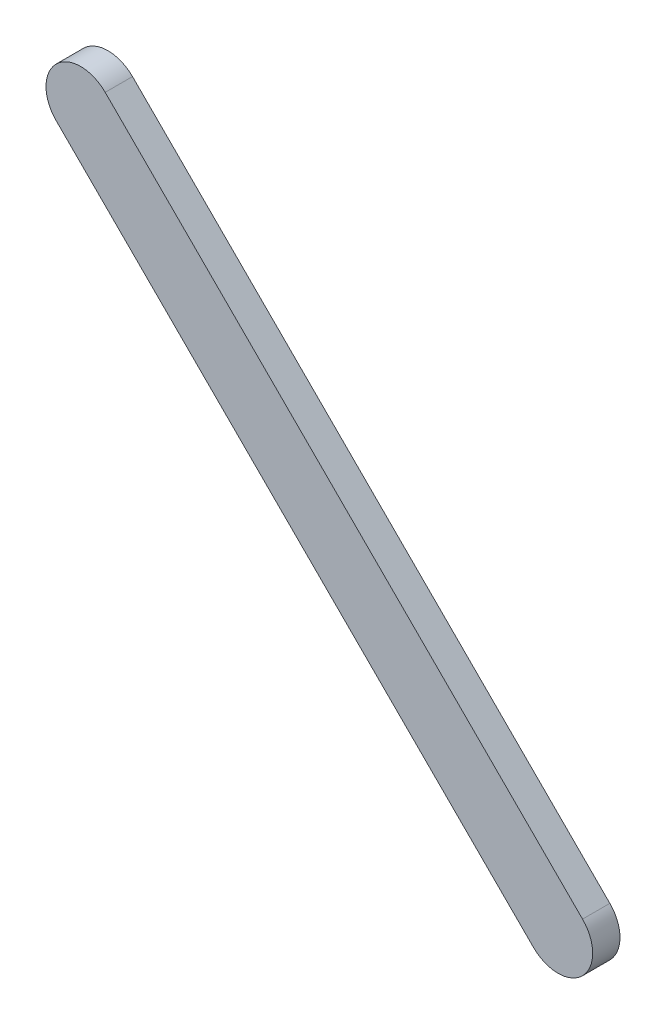
ISO-10303-21;
HEADER;
FILE_DESCRIPTION(('STEP AP214'),'2;1');
FILE_NAME('part.step','',(''),(''),'','','');
FILE_SCHEMA(('AUTOMOTIVE_DESIGN { 1 0 10303 214 1 1 1 1 }'));
ENDSEC;
DATA;
#1=APPLICATION_CONTEXT('core data for automotive mechanical design processes');
#2=APPLICATION_PROTOCOL_DEFINITION('international standard','automotive_design',2000,#1);
#3=PRODUCT_CONTEXT('',#1,'mechanical');
#4=PRODUCT('Part','Part','',(#3));
#5=PRODUCT_RELATED_PRODUCT_CATEGORY('part','',(#4));
#6=PRODUCT_DEFINITION_FORMATION('','',#4);
#7=PRODUCT_DEFINITION_CONTEXT('part definition',#1,'design');
#8=PRODUCT_DEFINITION('design','',#6,#7);
#9=PRODUCT_DEFINITION_SHAPE('','',#8);
#10=(LENGTH_UNIT() NAMED_UNIT(*) SI_UNIT(.MILLI.,.METRE.));
#11=(NAMED_UNIT(*) PLANE_ANGLE_UNIT() SI_UNIT($,.RADIAN.));
#12=(NAMED_UNIT(*) SI_UNIT($,.STERADIAN.) SOLID_ANGLE_UNIT());
#13=UNCERTAINTY_MEASURE_WITH_UNIT(LENGTH_MEASURE(1.E-05),#10,'distance_accuracy_value','');
#14=(GEOMETRIC_REPRESENTATION_CONTEXT(3) GLOBAL_UNCERTAINTY_ASSIGNED_CONTEXT((#13)) GLOBAL_UNIT_ASSIGNED_CONTEXT((#10,
#11,#12)) REPRESENTATION_CONTEXT('',''));
#15=CARTESIAN_POINT('',(0.,0.,0.));
#16=DIRECTION('',(0.,0.,1.));
#17=DIRECTION('',(1.,0.,0.));
#18=AXIS2_PLACEMENT_3D('',#15,#16,#17);
#19=CARTESIAN_POINT('',(136.65889102,97.1698971,0.));
#20=DIRECTION('',(0.707106781186548,0.707106781186548,0.));
#21=DIRECTION('',(0.707106781186548,-0.707106781186548,0.));
#22=AXIS2_PLACEMENT_3D('',#19,#20,#21);
#23=PLANE('',#22);
#24=DIRECTION('',(0.707106781186548,-0.707106781186548,0.));
#25=VECTOR('',#24,1.);
#26=CARTESIAN_POINT('',(136.65889102,97.1698971,0.1999996));
#27=LINE('',#26,#25);
#28=CARTESIAN_POINT('',(136.65889102,97.1698971,0.1999996));
#29=VERTEX_POINT('',#28);
#30=CARTESIAN_POINT('',(140.15539406,93.67339406,0.1999996));
#31=VERTEX_POINT('',#30);
#32=EDGE_CURVE('E11',#29,#31,#27,.T.);
#33=ORIENTED_EDGE('',*,*,#32,.F.);
#34=DIRECTION('',(0.,0.,1.));
#35=VECTOR('',#34,1.);
#36=CARTESIAN_POINT('',(136.65889102,97.1698971,0.));
#37=LINE('',#36,#35);
#38=CARTESIAN_POINT('',(136.65889102,97.1698971,0.));
#39=VERTEX_POINT('',#38);
#40=EDGE_CURVE('E24',#39,#29,#37,.T.);
#41=ORIENTED_EDGE('',*,*,#40,.F.);
#42=DIRECTION('',(0.707106781186548,-0.707106781186548,0.));
#43=VECTOR('',#42,1.);
#44=CARTESIAN_POINT('',(136.65889102,97.1698971,0.));
#45=LINE('',#44,#43);
#46=CARTESIAN_POINT('',(140.15539406,93.67339406,0.));
#47=VERTEX_POINT('',#46);
#48=EDGE_CURVE('E75',#39,#47,#45,.T.);
#49=ORIENTED_EDGE('',*,*,#48,.T.);
#50=DIRECTION('',(0.,0.,1.));
#51=VECTOR('',#50,1.);
#52=CARTESIAN_POINT('',(140.15539406,93.67339406,0.));
#53=LINE('',#52,#51);
#54=EDGE_CURVE('E37',#47,#31,#53,.T.);
#55=ORIENTED_EDGE('',*,*,#54,.T.);
#56=EDGE_LOOP('',(#33,#41,#49,#55));
#57=FACE_BOUND('',#56,.T.);
#58=ADVANCED_FACE('F17',(#57),#23,.F.);
#59=CARTESIAN_POINT('',(140.335,93.853,0.));
#60=DIRECTION('',(0.,0.,-1.));
#61=DIRECTION('',(-0.70710678118652,-0.707106781186576,0.));
#62=AXIS2_PLACEMENT_3D('',#59,#60,#61);
#63=CYLINDRICAL_SURFACE('',#62,0.254001156230774);
#64=CARTESIAN_POINT('',(140.335,93.853,0.1999996));
#65=DIRECTION('',(0.,0.,1.));
#66=DIRECTION('',(-0.70710678118652,-0.707106781186576,0.));
#67=AXIS2_PLACEMENT_3D('',#64,#65,#66);
#68=CIRCLE('',#67,0.254001156230774);
#69=CARTESIAN_POINT('',(140.51460594,94.03260594,0.1999996));
#70=VERTEX_POINT('',#69);
#71=EDGE_CURVE('E83',#31,#70,#68,.T.);
#72=ORIENTED_EDGE('',*,*,#71,.F.);
#73=ORIENTED_EDGE('',*,*,#54,.F.);
#74=CARTESIAN_POINT('',(140.335,93.853,0.));
#75=DIRECTION('',(0.,0.,1.));
#76=DIRECTION('',(-0.70710678118652,-0.707106781186576,0.));
#77=AXIS2_PLACEMENT_3D('',#74,#75,#76);
#78=CIRCLE('',#77,0.254001156230774);
#79=CARTESIAN_POINT('',(140.51460594,94.03260594,0.));
#80=VERTEX_POINT('',#79);
#81=EDGE_CURVE('E81',#47,#80,#78,.T.);
#82=ORIENTED_EDGE('',*,*,#81,.T.);
#83=DIRECTION('',(0.,0.,1.));
#84=VECTOR('',#83,1.);
#85=CARTESIAN_POINT('',(140.51460594,94.03260594,0.));
#86=LINE('',#85,#84);
#87=EDGE_CURVE('E67',#80,#70,#86,.T.);
#88=ORIENTED_EDGE('',*,*,#87,.T.);
#89=EDGE_LOOP('',(#72,#73,#82,#88));
#90=FACE_BOUND('',#89,.T.);
#91=ADVANCED_FACE('F89',(#90),#63,.T.);
#92=CARTESIAN_POINT('',(140.51460594,94.03260594,0.));
#93=DIRECTION('',(-0.707106781186545,-0.70710678118655,0.));
#94=DIRECTION('',(-0.70710678118655,0.707106781186545,0.));
#95=AXIS2_PLACEMENT_3D('',#92,#93,#94);
#96=PLANE('',#95);
#97=DIRECTION('',(-0.70710678118655,0.707106781186545,0.));
#98=VECTOR('',#97,1.);
#99=CARTESIAN_POINT('',(140.51460594,94.03260594,0.1999996));
#100=LINE('',#99,#98);
#101=CARTESIAN_POINT('',(137.0181029,97.52910898,0.1999996));
#102=VERTEX_POINT('',#101);
#103=EDGE_CURVE('E71',#70,#102,#100,.T.);
#104=ORIENTED_EDGE('',*,*,#103,.F.);
#105=ORIENTED_EDGE('',*,*,#87,.F.);
#106=DIRECTION('',(-0.70710678118655,0.707106781186545,0.));
#107=VECTOR('',#106,1.);
#108=CARTESIAN_POINT('',(140.51460594,94.03260594,0.));
#109=LINE('',#108,#107);
#110=CARTESIAN_POINT('',(137.0181029,97.52910898,0.));
#111=VERTEX_POINT('',#110);
#112=EDGE_CURVE('E63',#80,#111,#109,.T.);
#113=ORIENTED_EDGE('',*,*,#112,.T.);
#114=DIRECTION('',(0.,0.,1.));
#115=VECTOR('',#114,1.);
#116=CARTESIAN_POINT('',(137.0181029,97.52910898,0.));
#117=LINE('',#116,#115);
#118=EDGE_CURVE('E53',#111,#102,#117,.T.);
#119=ORIENTED_EDGE('',*,*,#118,.T.);
#120=EDGE_LOOP('',(#104,#105,#113,#119));
#121=FACE_BOUND('',#120,.T.);
#122=ADVANCED_FACE('F66',(#121),#96,.F.);
#123=CARTESIAN_POINT('',(136.83849696,97.34950304,0.));
#124=DIRECTION('',(0.,0.,-1.));
#125=DIRECTION('',(0.70710678118652,0.707106781186576,0.));
#126=AXIS2_PLACEMENT_3D('',#123,#124,#125);
#127=CYLINDRICAL_SURFACE('',#126,0.254001156230761);
#128=CARTESIAN_POINT('',(136.83849696,97.34950304,0.1999996));
#129=DIRECTION('',(0.,0.,1.));
#130=DIRECTION('',(0.70710678118652,0.707106781186576,0.));
#131=AXIS2_PLACEMENT_3D('',#128,#129,#130);
#132=CIRCLE('',#131,0.254001156230761);
#133=EDGE_CURVE('E59',#102,#29,#132,.T.);
#134=ORIENTED_EDGE('',*,*,#133,.F.);
#135=ORIENTED_EDGE('',*,*,#118,.F.);
#136=CARTESIAN_POINT('',(136.83849696,97.34950304,0.));
#137=DIRECTION('',(0.,0.,1.));
#138=DIRECTION('',(0.70710678118652,0.707106781186576,0.));
#139=AXIS2_PLACEMENT_3D('',#136,#137,#138);
#140=CIRCLE('',#139,0.254001156230761);
#141=EDGE_CURVE('E57',#111,#39,#140,.T.);
#142=ORIENTED_EDGE('',*,*,#141,.T.);
#143=ORIENTED_EDGE('',*,*,#40,.T.);
#144=EDGE_LOOP('',(#134,#135,#142,#143));
#145=FACE_BOUND('',#144,.T.);
#146=ADVANCED_FACE('F55',(#145),#127,.T.);
#147=CARTESIAN_POINT('',(136.65889102,97.1698971,0.));
#148=DIRECTION('',(0.,0.,-1.));
#149=DIRECTION('',(-1.,0.,0.));
#150=AXIS2_PLACEMENT_3D('',#147,#148,#149);
#151=PLANE('',#150);
#152=ORIENTED_EDGE('',*,*,#141,.F.);
#153=ORIENTED_EDGE('',*,*,#112,.F.);
#154=ORIENTED_EDGE('',*,*,#81,.F.);
#155=ORIENTED_EDGE('',*,*,#48,.F.);
#156=EDGE_LOOP('',(#152,#153,#154,#155));
#157=FACE_BOUND('',#156,.T.);
#158=ADVANCED_FACE('F74',(#157),#151,.T.);
#159=CARTESIAN_POINT('',(136.65889102,97.1698971,0.1999996));
#160=DIRECTION('',(0.,0.,-1.));
#161=DIRECTION('',(-1.,0.,0.));
#162=AXIS2_PLACEMENT_3D('',#159,#160,#161);
#163=PLANE('',#162);
#164=ORIENTED_EDGE('',*,*,#32,.T.);
#165=ORIENTED_EDGE('',*,*,#71,.T.);
#166=ORIENTED_EDGE('',*,*,#103,.T.);
#167=ORIENTED_EDGE('',*,*,#133,.T.);
#168=EDGE_LOOP('',(#164,#165,#166,#167));
#169=FACE_BOUND('',#168,.T.);
#170=ADVANCED_FACE('F91',(#169),#163,.F.);
#171=CLOSED_SHELL('',(#58,#91,#122,#146,#158,#170));
#172=MANIFOLD_SOLID_BREP('B1',#171);
#173=ADVANCED_BREP_SHAPE_REPRESENTATION('',(#18,#172),#14);
#174=SHAPE_DEFINITION_REPRESENTATION(#9,#173);
ENDSEC;
END-ISO-10303-21;
